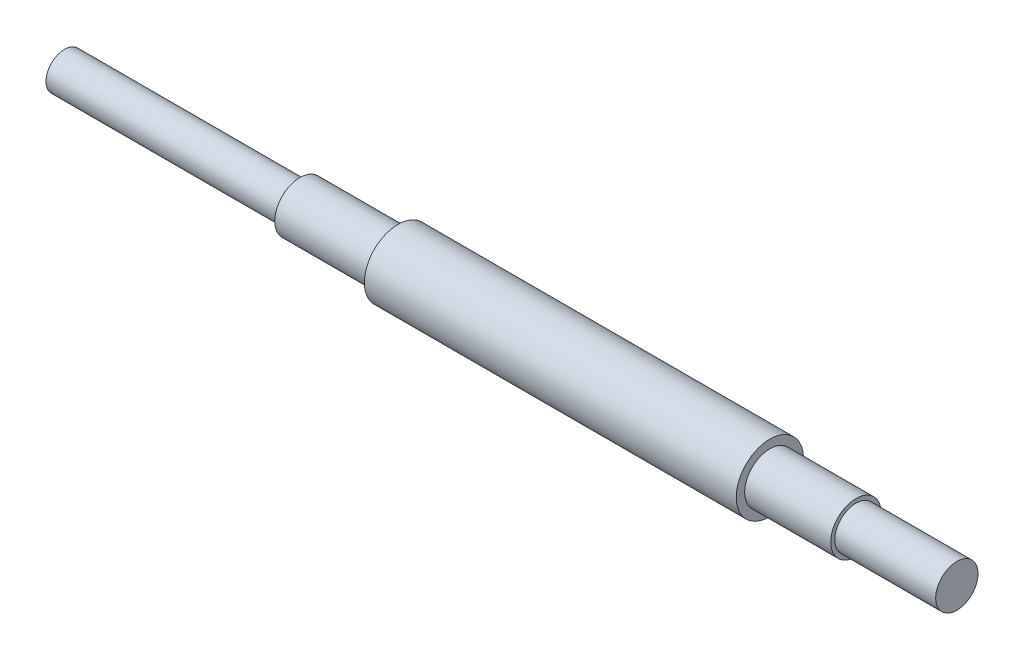
ISO-10303-21;
HEADER;
FILE_DESCRIPTION(('STEP AP214'),'2;1');
FILE_NAME('part.step','',(''),(''),'','','');
FILE_SCHEMA(('AUTOMOTIVE_DESIGN { 1 0 10303 214 1 1 1 1 }'));
ENDSEC;
DATA;
#1=APPLICATION_CONTEXT('core data for automotive mechanical design processes');
#2=APPLICATION_PROTOCOL_DEFINITION('international standard','automotive_design',2000,#1);
#3=PRODUCT_CONTEXT('',#1,'mechanical');
#4=PRODUCT('Part','Part','',(#3));
#5=PRODUCT_RELATED_PRODUCT_CATEGORY('part','',(#4));
#6=PRODUCT_DEFINITION_FORMATION('','',#4);
#7=PRODUCT_DEFINITION_CONTEXT('part definition',#1,'design');
#8=PRODUCT_DEFINITION('design','',#6,#7);
#9=PRODUCT_DEFINITION_SHAPE('','',#8);
#10=(LENGTH_UNIT() NAMED_UNIT(*) SI_UNIT(.MILLI.,.METRE.));
#11=(NAMED_UNIT(*) PLANE_ANGLE_UNIT() SI_UNIT($,.RADIAN.));
#12=(NAMED_UNIT(*) SI_UNIT($,.STERADIAN.) SOLID_ANGLE_UNIT());
#13=UNCERTAINTY_MEASURE_WITH_UNIT(LENGTH_MEASURE(1.E-05),#10,'distance_accuracy_value','');
#14=(GEOMETRIC_REPRESENTATION_CONTEXT(3) GLOBAL_UNCERTAINTY_ASSIGNED_CONTEXT((#13)) GLOBAL_UNIT_ASSIGNED_CONTEXT((#10,
#11,#12)) REPRESENTATION_CONTEXT('',''));
#15=CARTESIAN_POINT('',(0.,0.,0.));
#16=DIRECTION('',(0.,0.,1.));
#17=DIRECTION('',(1.,0.,0.));
#18=AXIS2_PLACEMENT_3D('',#15,#16,#17);
#19=CARTESIAN_POINT('',(-78.6305890500927,0.,0.));
#20=DIRECTION('',(1.,0.,0.));
#21=DIRECTION('',(0.,0.,-1.));
#22=AXIS2_PLACEMENT_3D('',#19,#20,#21);
#23=PLANE('',#22);
#24=CARTESIAN_POINT('',(-78.6305890500927,0.,0.));
#25=DIRECTION('',(-1.,0.,0.));
#26=DIRECTION('',(0.,0.,1.));
#27=AXIS2_PLACEMENT_3D('',#24,#25,#26);
#28=CIRCLE('',#27,3.499993);
#29=CARTESIAN_POINT('',(-78.6305890500927,0.,3.499993));
#30=VERTEX_POINT('',#29);
#31=EDGE_CURVE('E10',#30,#30,#28,.T.);
#32=ORIENTED_EDGE('',*,*,#31,.T.);
#33=EDGE_LOOP('',(#32));
#34=FACE_BOUND('',#33,.T.);
#35=ADVANCED_FACE('F35',(#34),#23,.F.);
#36=CARTESIAN_POINT('',(-97.95056704725,0.,0.));
#37=DIRECTION('',(-1.,0.,0.));
#38=DIRECTION('',(0.,0.,1.));
#39=AXIS2_PLACEMENT_3D('',#36,#37,#38);
#40=CYLINDRICAL_SURFACE('',#39,3.499993);
#41=ORIENTED_EDGE('',*,*,#31,.F.);
#42=EDGE_LOOP('',(#41));
#43=FACE_BOUND('',#42,.T.);
#44=CARTESIAN_POINT('',(-34.1805890500927,0.,0.));
#45=DIRECTION('',(-1.,0.,0.));
#46=DIRECTION('',(0.,0.,1.));
#47=AXIS2_PLACEMENT_3D('',#44,#45,#46);
#48=CIRCLE('',#47,3.499993);
#49=CARTESIAN_POINT('',(-34.1805890500927,0.,3.499993));
#50=VERTEX_POINT('',#49);
#51=EDGE_CURVE('E41',#50,#50,#48,.T.);
#52=ORIENTED_EDGE('',*,*,#51,.T.);
#53=EDGE_LOOP('',(#52));
#54=FACE_BOUND('',#53,.T.);
#55=ADVANCED_FACE('F85',(#43,#54),#40,.T.);
#56=CARTESIAN_POINT('',(-34.1805890500927,0.,-3.499993));
#57=DIRECTION('',(1.,0.,0.));
#58=DIRECTION('',(0.,0.,-1.));
#59=AXIS2_PLACEMENT_3D('',#56,#57,#58);
#60=PLANE('',#59);
#61=ORIENTED_EDGE('',*,*,#51,.F.);
#62=EDGE_LOOP('',(#61));
#63=FACE_BOUND('',#62,.T.);
#64=CARTESIAN_POINT('',(-34.1805890500927,0.,0.));
#65=DIRECTION('',(-1.,0.,0.));
#66=DIRECTION('',(0.,0.,1.));
#67=AXIS2_PLACEMENT_3D('',#64,#65,#66);
#68=CIRCLE('',#67,4.7625);
#69=CARTESIAN_POINT('',(-34.1805890500927,0.,4.7625));
#70=VERTEX_POINT('',#69);
#71=EDGE_CURVE('E45',#70,#70,#68,.T.);
#72=ORIENTED_EDGE('',*,*,#71,.T.);
#73=EDGE_LOOP('',(#72));
#74=FACE_BOUND('',#73,.T.);
#75=ADVANCED_FACE('F89',(#63,#74),#60,.F.);
#76=CARTESIAN_POINT('',(-97.95056704725,0.,0.));
#77=DIRECTION('',(-1.,0.,0.));
#78=DIRECTION('',(0.,0.,1.));
#79=AXIS2_PLACEMENT_3D('',#76,#77,#78);
#80=CYLINDRICAL_SURFACE('',#79,4.7625);
#81=ORIENTED_EDGE('',*,*,#71,.F.);
#82=EDGE_LOOP('',(#81));
#83=FACE_BOUND('',#82,.T.);
#84=CARTESIAN_POINT('',(-15.6688782960927,0.,0.));
#85=DIRECTION('',(-1.,0.,0.));
#86=DIRECTION('',(0.,0.,1.));
#87=AXIS2_PLACEMENT_3D('',#84,#85,#86);
#88=CIRCLE('',#87,4.7625);
#89=CARTESIAN_POINT('',(-15.6688782960927,0.,4.7625));
#90=VERTEX_POINT('',#89);
#91=EDGE_CURVE('E49',#90,#90,#88,.T.);
#92=ORIENTED_EDGE('',*,*,#91,.T.);
#93=EDGE_LOOP('',(#92));
#94=FACE_BOUND('',#93,.T.);
#95=ADVANCED_FACE('F94',(#83,#94),#80,.T.);
#96=CARTESIAN_POINT('',(-15.6688782960927,0.,-4.7625));
#97=DIRECTION('',(1.,0.,0.));
#98=DIRECTION('',(0.,0.,-1.));
#99=AXIS2_PLACEMENT_3D('',#96,#97,#98);
#100=PLANE('',#99);
#101=ORIENTED_EDGE('',*,*,#91,.F.);
#102=EDGE_LOOP('',(#101));
#103=FACE_BOUND('',#102,.T.);
#104=CARTESIAN_POINT('',(-15.6688782960927,0.,0.));
#105=DIRECTION('',(-1.,0.,0.));
#106=DIRECTION('',(0.,0.,1.));
#107=AXIS2_PLACEMENT_3D('',#104,#105,#106);
#108=CIRCLE('',#107,6.35);
#109=CARTESIAN_POINT('',(-15.6688782960927,0.,6.35));
#110=VERTEX_POINT('',#109);
#111=EDGE_CURVE('E54',#110,#110,#108,.T.);
#112=ORIENTED_EDGE('',*,*,#111,.T.);
#113=EDGE_LOOP('',(#112));
#114=FACE_BOUND('',#113,.T.);
#115=ADVANCED_FACE('F100',(#103,#114),#100,.F.);
#116=CARTESIAN_POINT('',(-97.95056704725,0.,0.));
#117=DIRECTION('',(-1.,0.,0.));
#118=DIRECTION('',(0.,0.,1.));
#119=AXIS2_PLACEMENT_3D('',#116,#117,#118);
#120=CYLINDRICAL_SURFACE('',#119,6.35);
#121=ORIENTED_EDGE('',*,*,#111,.F.);
#122=EDGE_LOOP('',(#121));
#123=FACE_BOUND('',#122,.T.);
#124=CARTESIAN_POINT('',(54.5493709039073,0.,0.));
#125=DIRECTION('',(-1.,0.,0.));
#126=DIRECTION('',(0.,0.,1.));
#127=AXIS2_PLACEMENT_3D('',#124,#125,#126);
#128=CIRCLE('',#127,6.35);
#129=CARTESIAN_POINT('',(54.5493709039073,0.,6.35));
#130=VERTEX_POINT('',#129);
#131=EDGE_CURVE('E57',#130,#130,#128,.T.);
#132=ORIENTED_EDGE('',*,*,#131,.T.);
#133=EDGE_LOOP('',(#132));
#134=FACE_BOUND('',#133,.T.);
#135=ADVANCED_FACE('F104',(#123,#134),#120,.T.);
#136=CARTESIAN_POINT('',(54.5493709039073,0.,-6.35));
#137=DIRECTION('',(-1.,0.,0.));
#138=DIRECTION('',(0.,0.,1.));
#139=AXIS2_PLACEMENT_3D('',#136,#137,#138);
#140=PLANE('',#139);
#141=ORIENTED_EDGE('',*,*,#131,.F.);
#142=EDGE_LOOP('',(#141));
#143=FACE_BOUND('',#142,.T.);
#144=CARTESIAN_POINT('',(54.5493709039073,0.,0.));
#145=DIRECTION('',(-1.,0.,0.));
#146=DIRECTION('',(0.,0.,1.));
#147=AXIS2_PLACEMENT_3D('',#144,#145,#146);
#148=CIRCLE('',#147,4.7625);
#149=CARTESIAN_POINT('',(54.5493709039073,0.,4.7625));
#150=VERTEX_POINT('',#149);
#151=EDGE_CURVE('E60',#150,#150,#148,.T.);
#152=ORIENTED_EDGE('',*,*,#151,.T.);
#153=EDGE_LOOP('',(#152));
#154=FACE_BOUND('',#153,.T.);
#155=ADVANCED_FACE('F108',(#143,#154),#140,.F.);
#156=CARTESIAN_POINT('',(-97.95056704725,0.,0.));
#157=DIRECTION('',(-1.,0.,0.));
#158=DIRECTION('',(0.,0.,1.));
#159=AXIS2_PLACEMENT_3D('',#156,#157,#158);
#160=CYLINDRICAL_SURFACE('',#159,4.7625);
#161=ORIENTED_EDGE('',*,*,#151,.F.);
#162=EDGE_LOOP('',(#161));
#163=FACE_BOUND('',#162,.T.);
#164=CARTESIAN_POINT('',(70.8053709039073,0.,0.));
#165=DIRECTION('',(-1.,0.,0.));
#166=DIRECTION('',(0.,0.,1.));
#167=AXIS2_PLACEMENT_3D('',#164,#165,#166);
#168=CIRCLE('',#167,4.7625);
#169=CARTESIAN_POINT('',(70.8053709039073,0.,4.7625));
#170=VERTEX_POINT('',#169);
#171=EDGE_CURVE('E63',#170,#170,#168,.T.);
#172=ORIENTED_EDGE('',*,*,#171,.T.);
#173=EDGE_LOOP('',(#172));
#174=FACE_BOUND('',#173,.T.);
#175=ADVANCED_FACE('F112',(#163,#174),#160,.T.);
#176=CARTESIAN_POINT('',(70.8053709039073,0.,-4.7625));
#177=DIRECTION('',(-1.,0.,0.));
#178=DIRECTION('',(0.,0.,1.));
#179=AXIS2_PLACEMENT_3D('',#176,#177,#178);
#180=PLANE('',#179);
#181=ORIENTED_EDGE('',*,*,#171,.F.);
#182=EDGE_LOOP('',(#181));
#183=FACE_BOUND('',#182,.T.);
#184=CARTESIAN_POINT('',(70.8053709039073,0.,0.));
#185=DIRECTION('',(-1.,0.,0.));
#186=DIRECTION('',(0.,0.,1.));
#187=AXIS2_PLACEMENT_3D('',#184,#185,#186);
#188=CIRCLE('',#187,3.99923);
#189=CARTESIAN_POINT('',(70.8053709039073,0.,3.99923));
#190=VERTEX_POINT('',#189);
#191=EDGE_CURVE('E66',#190,#190,#188,.T.);
#192=ORIENTED_EDGE('',*,*,#191,.T.);
#193=EDGE_LOOP('',(#192));
#194=FACE_BOUND('',#193,.T.);
#195=ADVANCED_FACE('F81',(#183,#194),#180,.F.);
#196=CARTESIAN_POINT('',(-97.95056704725,0.,0.));
#197=DIRECTION('',(-1.,0.,0.));
#198=DIRECTION('',(0.,0.,1.));
#199=AXIS2_PLACEMENT_3D('',#196,#197,#198);
#200=CYLINDRICAL_SURFACE('',#199,3.99923);
#201=ORIENTED_EDGE('',*,*,#191,.F.);
#202=EDGE_LOOP('',(#201));
#203=FACE_BOUND('',#202,.T.);
#204=CARTESIAN_POINT('',(89.8553709039073,0.,0.));
#205=DIRECTION('',(-1.,0.,0.));
#206=DIRECTION('',(0.,0.,1.));
#207=AXIS2_PLACEMENT_3D('',#204,#205,#206);
#208=CIRCLE('',#207,3.99923);
#209=CARTESIAN_POINT('',(89.8553709039073,0.,3.99923));
#210=VERTEX_POINT('',#209);
#211=EDGE_CURVE('E69',#210,#210,#208,.T.);
#212=ORIENTED_EDGE('',*,*,#211,.T.);
#213=EDGE_LOOP('',(#212));
#214=FACE_BOUND('',#213,.T.);
#215=ADVANCED_FACE('F73',(#203,#214),#200,.T.);
#216=CARTESIAN_POINT('',(89.8553709039073,0.,-3.99923));
#217=DIRECTION('',(-1.,0.,0.));
#218=DIRECTION('',(0.,0.,1.));
#219=AXIS2_PLACEMENT_3D('',#216,#217,#218);
#220=PLANE('',#219);
#221=ORIENTED_EDGE('',*,*,#211,.F.);
#222=EDGE_LOOP('',(#221));
#223=FACE_BOUND('',#222,.T.);
#224=ADVANCED_FACE('F75',(#223),#220,.F.);
#225=CLOSED_SHELL('',(#35,#55,#75,#95,#115,#135,#155,#175,#195,#215,#224));
#226=MANIFOLD_SOLID_BREP('B2',#225);
#227=ADVANCED_BREP_SHAPE_REPRESENTATION('',(#18,#226),#14);
#228=SHAPE_DEFINITION_REPRESENTATION(#9,#227);
ENDSEC;
END-ISO-10303-21;
